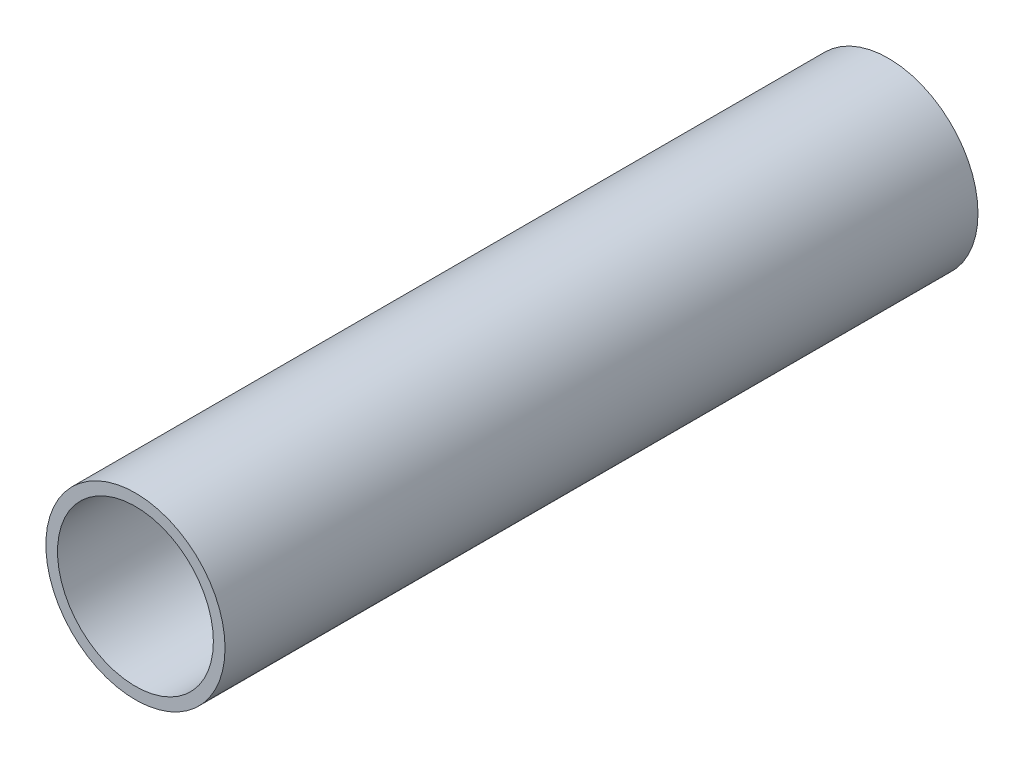
ISO-10303-21;
HEADER;
FILE_DESCRIPTION(('STEP AP214'),'2;1');
FILE_NAME('part.step','',(''),(''),'','','');
FILE_SCHEMA(('AUTOMOTIVE_DESIGN { 1 0 10303 214 1 1 1 1 }'));
ENDSEC;
DATA;
#1=APPLICATION_CONTEXT('core data for automotive mechanical design processes');
#2=APPLICATION_PROTOCOL_DEFINITION('international standard','automotive_design',2000,#1);
#3=PRODUCT_CONTEXT('',#1,'mechanical');
#4=PRODUCT('Part','Part','',(#3));
#5=PRODUCT_RELATED_PRODUCT_CATEGORY('part','',(#4));
#6=PRODUCT_DEFINITION_FORMATION('','',#4);
#7=PRODUCT_DEFINITION_CONTEXT('part definition',#1,'design');
#8=PRODUCT_DEFINITION('design','',#6,#7);
#9=PRODUCT_DEFINITION_SHAPE('','',#8);
#10=(LENGTH_UNIT() NAMED_UNIT(*) SI_UNIT(.MILLI.,.METRE.));
#11=(NAMED_UNIT(*) PLANE_ANGLE_UNIT() SI_UNIT($,.RADIAN.));
#12=(NAMED_UNIT(*) SI_UNIT($,.STERADIAN.) SOLID_ANGLE_UNIT());
#13=UNCERTAINTY_MEASURE_WITH_UNIT(LENGTH_MEASURE(1.E-05),#10,'distance_accuracy_value','');
#14=(GEOMETRIC_REPRESENTATION_CONTEXT(3) GLOBAL_UNCERTAINTY_ASSIGNED_CONTEXT((#13)) GLOBAL_UNIT_ASSIGNED_CONTEXT((#10,
#11,#12)) REPRESENTATION_CONTEXT('',''));
#15=CARTESIAN_POINT('',(0.,0.,0.));
#16=DIRECTION('',(0.,0.,1.));
#17=DIRECTION('',(1.,0.,0.));
#18=AXIS2_PLACEMENT_3D('',#15,#16,#17);
#19=CARTESIAN_POINT('',(0.,0.,254.));
#20=DIRECTION('',(0.,0.,1.));
#21=DIRECTION('',(1.,0.,0.));
#22=AXIS2_PLACEMENT_3D('',#19,#20,#21);
#23=PLANE('',#22);
#24=CARTESIAN_POINT('',(0.,0.,254.));
#25=DIRECTION('',(0.,0.,1.));
#26=DIRECTION('',(1.,0.,0.));
#27=AXIS2_PLACEMENT_3D('',#24,#25,#26);
#28=CIRCLE('',#27,30.226);
#29=CARTESIAN_POINT('',(30.226,0.,254.));
#30=VERTEX_POINT('',#29);
#31=EDGE_CURVE('E10',#30,#30,#28,.T.);
#32=ORIENTED_EDGE('',*,*,#31,.T.);
#33=EDGE_LOOP('',(#32));
#34=FACE_BOUND('',#33,.T.);
#35=CARTESIAN_POINT('',(0.,0.,254.));
#36=DIRECTION('',(0.,0.,1.));
#37=DIRECTION('',(1.,0.,0.));
#38=AXIS2_PLACEMENT_3D('',#35,#36,#37);
#39=CIRCLE('',#38,26.289);
#40=CARTESIAN_POINT('',(26.289,0.,254.));
#41=VERTEX_POINT('',#40);
#42=EDGE_CURVE('E42',#41,#41,#39,.T.);
#43=ORIENTED_EDGE('',*,*,#42,.F.);
#44=EDGE_LOOP('',(#43));
#45=FACE_BOUND('',#44,.T.);
#46=ADVANCED_FACE('F31',(#34,#45),#23,.T.);
#47=CARTESIAN_POINT('',(0.,0.,0.));
#48=DIRECTION('',(0.,0.,1.));
#49=DIRECTION('',(1.,0.,0.));
#50=AXIS2_PLACEMENT_3D('',#47,#48,#49);
#51=PLANE('',#50);
#52=CARTESIAN_POINT('',(0.,0.,0.));
#53=DIRECTION('',(0.,0.,1.));
#54=DIRECTION('',(1.,0.,0.));
#55=AXIS2_PLACEMENT_3D('',#52,#53,#54);
#56=CIRCLE('',#55,30.226);
#57=CARTESIAN_POINT('',(30.226,0.,0.));
#58=VERTEX_POINT('',#57);
#59=EDGE_CURVE('E35',#58,#58,#56,.T.);
#60=ORIENTED_EDGE('',*,*,#59,.F.);
#61=EDGE_LOOP('',(#60));
#62=FACE_BOUND('',#61,.T.);
#63=CARTESIAN_POINT('',(0.,0.,0.));
#64=DIRECTION('',(0.,0.,1.));
#65=DIRECTION('',(1.,0.,0.));
#66=AXIS2_PLACEMENT_3D('',#63,#64,#65);
#67=CIRCLE('',#66,26.289);
#68=CARTESIAN_POINT('',(26.289,0.,0.));
#69=VERTEX_POINT('',#68);
#70=EDGE_CURVE('E44',#69,#69,#67,.T.);
#71=ORIENTED_EDGE('',*,*,#70,.T.);
#72=EDGE_LOOP('',(#71));
#73=FACE_BOUND('',#72,.T.);
#74=ADVANCED_FACE('F54',(#62,#73),#51,.F.);
#75=CARTESIAN_POINT('',(0.,0.,254.));
#76=DIRECTION('',(0.,0.,-1.));
#77=DIRECTION('',(-1.,0.,0.));
#78=AXIS2_PLACEMENT_3D('',#75,#76,#77);
#79=CYLINDRICAL_SURFACE('',#78,30.226);
#80=ORIENTED_EDGE('',*,*,#31,.F.);
#81=EDGE_LOOP('',(#80));
#82=FACE_BOUND('',#81,.T.);
#83=ORIENTED_EDGE('',*,*,#59,.T.);
#84=EDGE_LOOP('',(#83));
#85=FACE_BOUND('',#84,.T.);
#86=ADVANCED_FACE('F33',(#82,#85),#79,.T.);
#87=CARTESIAN_POINT('',(0.,0.,254.));
#88=DIRECTION('',(0.,0.,-1.));
#89=DIRECTION('',(-1.,0.,0.));
#90=AXIS2_PLACEMENT_3D('',#87,#88,#89);
#91=CYLINDRICAL_SURFACE('',#90,26.289);
#92=ORIENTED_EDGE('',*,*,#42,.T.);
#93=EDGE_LOOP('',(#92));
#94=FACE_BOUND('',#93,.T.);
#95=ORIENTED_EDGE('',*,*,#70,.F.);
#96=EDGE_LOOP('',(#95));
#97=FACE_BOUND('',#96,.T.);
#98=ADVANCED_FACE('F50',(#94,#97),#91,.F.);
#99=CLOSED_SHELL('',(#46,#74,#86,#98));
#100=MANIFOLD_SOLID_BREP('B2',#99);
#101=ADVANCED_BREP_SHAPE_REPRESENTATION('',(#18,#100),#14);
#102=SHAPE_DEFINITION_REPRESENTATION(#9,#101);
ENDSEC;
END-ISO-10303-21;
